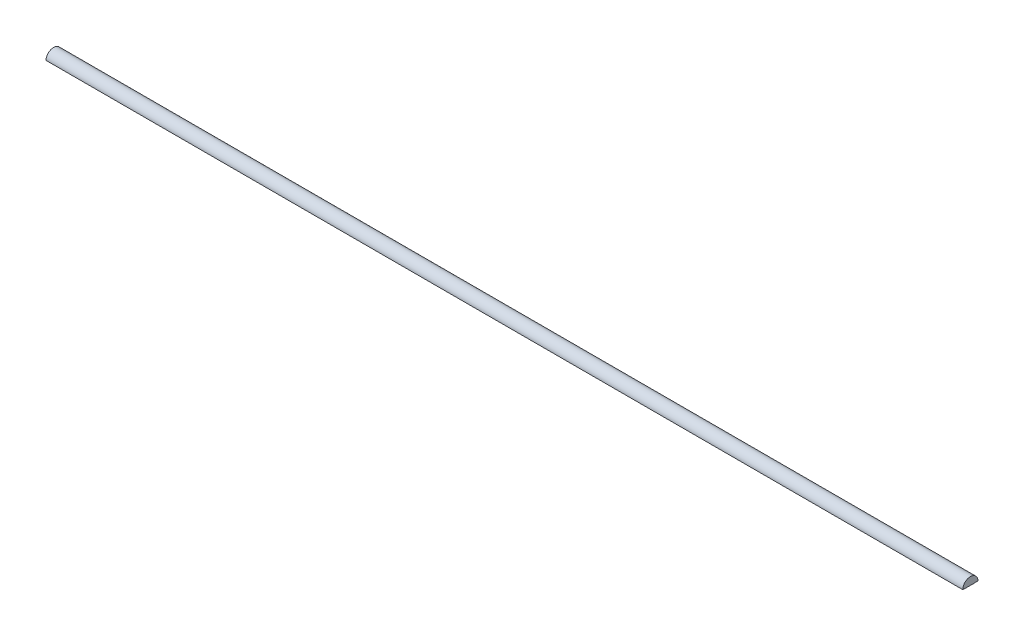
ISO-10303-21;
HEADER;
FILE_DESCRIPTION(('STEP AP214'),'2;1');
FILE_NAME('part.step','',(''),(''),'','','');
FILE_SCHEMA(('AUTOMOTIVE_DESIGN { 1 0 10303 214 1 1 1 1 }'));
ENDSEC;
DATA;
#1=APPLICATION_CONTEXT('core data for automotive mechanical design processes');
#2=APPLICATION_PROTOCOL_DEFINITION('international standard','automotive_design',2000,#1);
#3=PRODUCT_CONTEXT('',#1,'mechanical');
#4=PRODUCT('Part','Part','',(#3));
#5=PRODUCT_RELATED_PRODUCT_CATEGORY('part','',(#4));
#6=PRODUCT_DEFINITION_FORMATION('','',#4);
#7=PRODUCT_DEFINITION_CONTEXT('part definition',#1,'design');
#8=PRODUCT_DEFINITION('design','',#6,#7);
#9=PRODUCT_DEFINITION_SHAPE('','',#8);
#10=(LENGTH_UNIT() NAMED_UNIT(*) SI_UNIT(.MILLI.,.METRE.));
#11=(NAMED_UNIT(*) PLANE_ANGLE_UNIT() SI_UNIT($,.RADIAN.));
#12=(NAMED_UNIT(*) SI_UNIT($,.STERADIAN.) SOLID_ANGLE_UNIT());
#13=UNCERTAINTY_MEASURE_WITH_UNIT(LENGTH_MEASURE(1.E-05),#10,'distance_accuracy_value','');
#14=(GEOMETRIC_REPRESENTATION_CONTEXT(3) GLOBAL_UNCERTAINTY_ASSIGNED_CONTEXT((#13)) GLOBAL_UNIT_ASSIGNED_CONTEXT((#10,
#11,#12)) REPRESENTATION_CONTEXT('',''));
#15=CARTESIAN_POINT('',(0.,0.,0.));
#16=DIRECTION('',(0.,0.,1.));
#17=DIRECTION('',(1.,0.,0.));
#18=AXIS2_PLACEMENT_3D('',#15,#16,#17);
#19=CARTESIAN_POINT('',(381.,-63.5,0.));
#20=DIRECTION('',(-1.,0.,0.));
#21=DIRECTION('',(0.,0.,1.));
#22=AXIS2_PLACEMENT_3D('',#19,#20,#21);
#23=CYLINDRICAL_SURFACE('',#22,3.17500000000022);
#24=CARTESIAN_POINT('',(0.,-63.5,0.));
#25=DIRECTION('',(1.,0.,0.));
#26=DIRECTION('',(0.,0.,-1.));
#27=AXIS2_PLACEMENT_3D('',#24,#25,#26);
#28=CIRCLE('',#27,3.17500000000022);
#29=CARTESIAN_POINT('',(0.,-63.420625,-3.17400765742244));
#30=VERTEX_POINT('',#29);
#31=CARTESIAN_POINT('',(0.,-63.420625,3.17400765742246));
#32=VERTEX_POINT('',#31);
#33=EDGE_CURVE('E76',#30,#32,#28,.T.);
#34=ORIENTED_EDGE('',*,*,#33,.T.);
#35=DIRECTION('',(-1.,0.,0.));
#36=VECTOR('',#35,1.);
#37=CARTESIAN_POINT('',(381.,-63.420625,3.17400765742246));
#38=LINE('',#37,#36);
#39=CARTESIAN_POINT('',(381.,-63.420625,3.17400765742246));
#40=VERTEX_POINT('',#39);
#41=EDGE_CURVE('E11',#40,#32,#38,.T.);
#42=ORIENTED_EDGE('',*,*,#41,.F.);
#43=CARTESIAN_POINT('',(381.,-63.5,0.));
#44=DIRECTION('',(1.,0.,0.));
#45=DIRECTION('',(0.,0.,-1.));
#46=AXIS2_PLACEMENT_3D('',#43,#44,#45);
#47=CIRCLE('',#46,3.17500000000022);
#48=CARTESIAN_POINT('',(381.,-63.420625,-3.17400765742244));
#49=VERTEX_POINT('',#48);
#50=EDGE_CURVE('E80',#49,#40,#47,.T.);
#51=ORIENTED_EDGE('',*,*,#50,.F.);
#52=DIRECTION('',(-1.,0.,0.));
#53=VECTOR('',#52,1.);
#54=CARTESIAN_POINT('',(381.,-63.420625,-3.17400765742244));
#55=LINE('',#54,#53);
#56=EDGE_CURVE('E53',#49,#30,#55,.T.);
#57=ORIENTED_EDGE('',*,*,#56,.T.);
#58=EDGE_LOOP('',(#34,#42,#51,#57));
#59=FACE_BOUND('',#58,.T.);
#60=ADVANCED_FACE('F44',(#59),#23,.T.);
#61=CARTESIAN_POINT('',(381.,0.,0.));
#62=DIRECTION('',(-1.,0.,0.));
#63=DIRECTION('',(0.,0.,1.));
#64=AXIS2_PLACEMENT_3D('',#61,#62,#63);
#65=CYLINDRICAL_SURFACE('',#64,63.5);
#66=CARTESIAN_POINT('',(0.,0.,0.));
#67=DIRECTION('',(1.,0.,0.));
#68=DIRECTION('',(0.,0.,-1.));
#69=AXIS2_PLACEMENT_3D('',#66,#67,#68);
#70=CIRCLE('',#69,63.5);
#71=EDGE_CURVE('E66',#32,#30,#70,.T.);
#72=ORIENTED_EDGE('',*,*,#71,.T.);
#73=ORIENTED_EDGE('',*,*,#56,.F.);
#74=CARTESIAN_POINT('',(381.,0.,0.));
#75=DIRECTION('',(1.,0.,0.));
#76=DIRECTION('',(0.,0.,-1.));
#77=AXIS2_PLACEMENT_3D('',#74,#75,#76);
#78=CIRCLE('',#77,63.5);
#79=EDGE_CURVE('E63',#40,#49,#78,.T.);
#80=ORIENTED_EDGE('',*,*,#79,.F.);
#81=ORIENTED_EDGE('',*,*,#41,.T.);
#82=EDGE_LOOP('',(#72,#73,#80,#81));
#83=FACE_BOUND('',#82,.T.);
#84=ADVANCED_FACE('F75',(#83),#65,.T.);
#85=CARTESIAN_POINT('',(381.,-31.75,0.));
#86=DIRECTION('',(1.,0.,0.));
#87=DIRECTION('',(0.,0.,-1.));
#88=AXIS2_PLACEMENT_3D('',#85,#86,#87);
#89=PLANE('',#88);
#90=ORIENTED_EDGE('',*,*,#50,.T.);
#91=ORIENTED_EDGE('',*,*,#79,.T.);
#92=EDGE_LOOP('',(#90,#91));
#93=FACE_BOUND('',#92,.T.);
#94=ADVANCED_FACE('F90',(#93),#89,.T.);
#95=CARTESIAN_POINT('',(0.,-31.75,0.));
#96=DIRECTION('',(1.,0.,0.));
#97=DIRECTION('',(0.,0.,-1.));
#98=AXIS2_PLACEMENT_3D('',#95,#96,#97);
#99=PLANE('',#98);
#100=ORIENTED_EDGE('',*,*,#33,.F.);
#101=ORIENTED_EDGE('',*,*,#71,.F.);
#102=EDGE_LOOP('',(#100,#101));
#103=FACE_BOUND('',#102,.T.);
#104=ADVANCED_FACE('F85',(#103),#99,.F.);
#105=CLOSED_SHELL('',(#60,#84,#94,#104));
#106=MANIFOLD_SOLID_BREP('B2',#105);
#107=ADVANCED_BREP_SHAPE_REPRESENTATION('',(#18,#106),#14);
#108=SHAPE_DEFINITION_REPRESENTATION(#9,#107);
ENDSEC;
END-ISO-10303-21;
